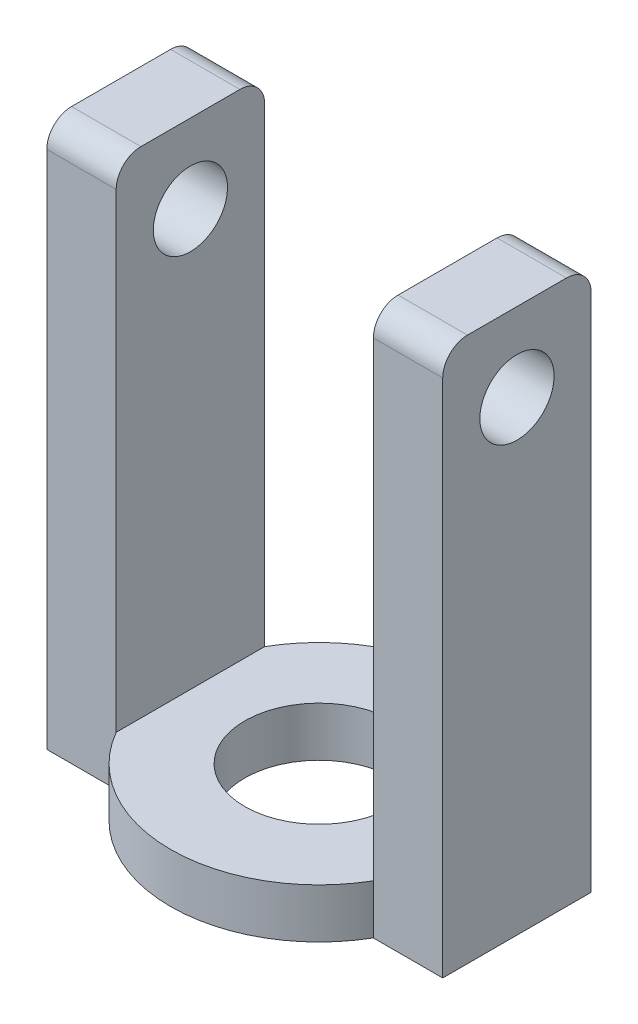
ISO-10303-21;
HEADER;
FILE_DESCRIPTION(('STEP AP214'),'2;1');
FILE_NAME('part.step','',(''),(''),'','','');
FILE_SCHEMA(('AUTOMOTIVE_DESIGN { 1 0 10303 214 1 1 1 1 }'));
ENDSEC;
DATA;
#1=APPLICATION_CONTEXT('core data for automotive mechanical design processes');
#2=APPLICATION_PROTOCOL_DEFINITION('international standard','automotive_design',2000,#1);
#3=PRODUCT_CONTEXT('',#1,'mechanical');
#4=PRODUCT('Part','Part','',(#3));
#5=PRODUCT_RELATED_PRODUCT_CATEGORY('part','',(#4));
#6=PRODUCT_DEFINITION_FORMATION('','',#4);
#7=PRODUCT_DEFINITION_CONTEXT('part definition',#1,'design');
#8=PRODUCT_DEFINITION('design','',#6,#7);
#9=PRODUCT_DEFINITION_SHAPE('','',#8);
#10=(LENGTH_UNIT() NAMED_UNIT(*) SI_UNIT(.MILLI.,.METRE.));
#11=(NAMED_UNIT(*) PLANE_ANGLE_UNIT() SI_UNIT($,.RADIAN.));
#12=(NAMED_UNIT(*) SI_UNIT($,.STERADIAN.) SOLID_ANGLE_UNIT());
#13=UNCERTAINTY_MEASURE_WITH_UNIT(LENGTH_MEASURE(1.E-05),#10,'distance_accuracy_value','');
#14=(GEOMETRIC_REPRESENTATION_CONTEXT(3) GLOBAL_UNCERTAINTY_ASSIGNED_CONTEXT((#13)) GLOBAL_UNIT_ASSIGNED_CONTEXT((#10,
#11,#12)) REPRESENTATION_CONTEXT('',''));
#15=CARTESIAN_POINT('',(0.,0.,0.));
#16=DIRECTION('',(0.,0.,1.));
#17=DIRECTION('',(1.,0.,0.));
#18=AXIS2_PLACEMENT_3D('',#15,#16,#17);
#19=CARTESIAN_POINT('',(0.,100.,0.));
#20=DIRECTION('',(0.,1.,0.));
#21=DIRECTION('',(0.,0.,1.));
#22=AXIS2_PLACEMENT_3D('',#19,#20,#21);
#23=PLANE('',#22);
#24=CARTESIAN_POINT('',(0.,100.,0.));
#25=DIRECTION('',(0.,1.,0.));
#26=DIRECTION('',(0.,0.,1.));
#27=AXIS2_PLACEMENT_3D('',#24,#25,#26);
#28=CIRCLE('',#27,150.);
#29=CARTESIAN_POINT('',(0.,100.,150.));
#30=VERTEX_POINT('',#29);
#31=EDGE_CURVE('E350',#30,#30,#28,.T.);
#32=ORIENTED_EDGE('',*,*,#31,.F.);
#33=EDGE_LOOP('',(#32));
#34=FACE_BOUND('',#33,.T.);
#35=CARTESIAN_POINT('',(0.,100.,0.));
#36=DIRECTION('',(0.,1.,0.));
#37=DIRECTION('',(0.,0.,1.));
#38=AXIS2_PLACEMENT_3D('',#35,#36,#37);
#39=CIRCLE('',#38,300.);
#40=CARTESIAN_POINT('',(-259.807621135332,100.,150.));
#41=VERTEX_POINT('',#40);
#42=CARTESIAN_POINT('',(259.807621135332,100.,150.));
#43=VERTEX_POINT('',#42);
#44=EDGE_CURVE('E159',#41,#43,#39,.T.);
#45=ORIENTED_EDGE('',*,*,#44,.T.);
#46=DIRECTION('',(0.,0.,1.));
#47=VECTOR('',#46,1.);
#48=CARTESIAN_POINT('',(259.807621135332,100.,-150.));
#49=LINE('',#48,#47);
#50=CARTESIAN_POINT('',(259.807621135332,100.,-150.));
#51=VERTEX_POINT('',#50);
#52=EDGE_CURVE('E148',#51,#43,#49,.T.);
#53=ORIENTED_EDGE('',*,*,#52,.F.);
#54=CARTESIAN_POINT('',(0.,100.,0.));
#55=DIRECTION('',(0.,1.,0.));
#56=DIRECTION('',(0.,0.,1.));
#57=AXIS2_PLACEMENT_3D('',#54,#55,#56);
#58=CIRCLE('',#57,300.);
#59=CARTESIAN_POINT('',(-259.807621135332,100.,-150.));
#60=VERTEX_POINT('',#59);
#61=EDGE_CURVE('E165',#51,#60,#58,.T.);
#62=ORIENTED_EDGE('',*,*,#61,.T.);
#63=DIRECTION('',(0.,0.,1.));
#64=VECTOR('',#63,1.);
#65=CARTESIAN_POINT('',(-259.807621135332,100.,-150.));
#66=LINE('',#65,#64);
#67=EDGE_CURVE('E154',#60,#41,#66,.T.);
#68=ORIENTED_EDGE('',*,*,#67,.T.);
#69=EDGE_LOOP('',(#45,#53,#62,#68));
#70=FACE_BOUND('',#69,.T.);
#71=ADVANCED_FACE('F34',(#34,#70),#23,.T.);
#72=CARTESIAN_POINT('',(0.,100.,0.));
#73=DIRECTION('',(0.,-1.,0.));
#74=DIRECTION('',(0.,0.,-1.));
#75=AXIS2_PLACEMENT_3D('',#72,#73,#74);
#76=CYLINDRICAL_SURFACE('',#75,300.);
#77=CARTESIAN_POINT('',(0.,0.,0.));
#78=DIRECTION('',(0.,1.,0.));
#79=DIRECTION('',(0.,0.,1.));
#80=AXIS2_PLACEMENT_3D('',#77,#78,#79);
#81=CIRCLE('',#80,300.);
#82=CARTESIAN_POINT('',(259.807621135332,0.,-150.));
#83=VERTEX_POINT('',#82);
#84=CARTESIAN_POINT('',(-259.807621135332,0.,-150.));
#85=VERTEX_POINT('',#84);
#86=EDGE_CURVE('E321',#83,#85,#81,.T.);
#87=ORIENTED_EDGE('',*,*,#86,.T.);
#88=DIRECTION('',(0.,-1.,0.));
#89=VECTOR('',#88,1.);
#90=CARTESIAN_POINT('',(-259.807621135332,100.,-150.));
#91=LINE('',#90,#89);
#92=EDGE_CURVE('E182',#60,#85,#91,.T.);
#93=ORIENTED_EDGE('',*,*,#92,.F.);
#94=ORIENTED_EDGE('',*,*,#61,.F.);
#95=DIRECTION('',(0.,-1.,0.));
#96=VECTOR('',#95,1.);
#97=CARTESIAN_POINT('',(259.807621135332,100.,-150.));
#98=LINE('',#97,#96);
#99=EDGE_CURVE('E164',#51,#83,#98,.T.);
#100=ORIENTED_EDGE('',*,*,#99,.T.);
#101=EDGE_LOOP('',(#87,#93,#94,#100));
#102=FACE_BOUND('',#101,.T.);
#103=ADVANCED_FACE('F257',(#102),#76,.T.);
#104=CARTESIAN_POINT('',(0.,100.,-150.));
#105=DIRECTION('',(0.,0.,-1.));
#106=DIRECTION('',(-1.,0.,0.));
#107=AXIS2_PLACEMENT_3D('',#104,#105,#106);
#108=PLANE('',#107);
#109=DIRECTION('',(0.,-1.,0.));
#110=VECTOR('',#109,1.);
#111=CARTESIAN_POINT('',(-400.,100.,-150.));
#112=LINE('',#111,#110);
#113=CARTESIAN_POINT('',(-400.,1050.,-150.));
#114=VERTEX_POINT('',#113);
#115=CARTESIAN_POINT('',(-400.,0.,-150.));
#116=VERTEX_POINT('',#115);
#117=EDGE_CURVE('E180',#114,#116,#112,.T.);
#118=ORIENTED_EDGE('',*,*,#117,.F.);
#119=DIRECTION('',(1.,0.,0.));
#120=VECTOR('',#119,1.);
#121=CARTESIAN_POINT('',(-259.807621135332,1050.,-150.));
#122=LINE('',#121,#120);
#123=CARTESIAN_POINT('',(-259.807621135332,1050.,-150.));
#124=VERTEX_POINT('',#123);
#125=EDGE_CURVE('E199',#114,#124,#122,.T.);
#126=ORIENTED_EDGE('',*,*,#125,.T.);
#127=DIRECTION('',(0.,-1.,0.));
#128=VECTOR('',#127,1.);
#129=CARTESIAN_POINT('',(-259.807621135332,1100.,-150.));
#130=LINE('',#129,#128);
#131=EDGE_CURVE('E340',#124,#60,#130,.T.);
#132=ORIENTED_EDGE('',*,*,#131,.T.);
#133=ORIENTED_EDGE('',*,*,#92,.T.);
#134=DIRECTION('',(1.,0.,0.));
#135=VECTOR('',#134,1.);
#136=CARTESIAN_POINT('',(0.,0.,-150.));
#137=LINE('',#136,#135);
#138=EDGE_CURVE('E317',#116,#85,#137,.T.);
#139=ORIENTED_EDGE('',*,*,#138,.F.);
#140=EDGE_LOOP('',(#118,#126,#132,#133,#139));
#141=FACE_BOUND('',#140,.T.);
#142=ADVANCED_FACE('F263',(#141),#108,.T.);
#143=CARTESIAN_POINT('',(-400.,100.,0.));
#144=DIRECTION('',(1.,0.,0.));
#145=DIRECTION('',(0.,0.,-1.));
#146=AXIS2_PLACEMENT_3D('',#143,#144,#145);
#147=PLANE('',#146);
#148=CARTESIAN_POINT('',(-400.,941.064540291286,0.));
#149=DIRECTION('',(-1.,0.,0.));
#150=DIRECTION('',(0.,0.,1.));
#151=AXIS2_PLACEMENT_3D('',#148,#149,#150);
#152=CIRCLE('',#151,75.);
#153=CARTESIAN_POINT('',(-400.,941.064540291286,75.));
#154=VERTEX_POINT('',#153);
#155=EDGE_CURVE('E358',#154,#154,#152,.T.);
#156=ORIENTED_EDGE('',*,*,#155,.F.);
#157=EDGE_LOOP('',(#156));
#158=FACE_BOUND('',#157,.T.);
#159=DIRECTION('',(0.,-1.,0.));
#160=VECTOR('',#159,1.);
#161=CARTESIAN_POINT('',(-400.,100.,150.));
#162=LINE('',#161,#160);
#163=CARTESIAN_POINT('',(-400.,1050.,150.));
#164=VERTEX_POINT('',#163);
#165=CARTESIAN_POINT('',(-400.,0.,150.));
#166=VERTEX_POINT('',#165);
#167=EDGE_CURVE('E173',#164,#166,#162,.T.);
#168=ORIENTED_EDGE('',*,*,#167,.F.);
#169=CARTESIAN_POINT('',(-400.,1050.,100.));
#170=DIRECTION('',(1.,0.,0.));
#171=DIRECTION('',(0.,0.,-1.));
#172=AXIS2_PLACEMENT_3D('',#169,#170,#171);
#173=CIRCLE('',#172,50.);
#174=CARTESIAN_POINT('',(-400.,1100.,100.));
#175=VERTEX_POINT('',#174);
#176=EDGE_CURVE('E197',#164,#175,#173,.F.);
#177=ORIENTED_EDGE('',*,*,#176,.T.);
#178=DIRECTION('',(0.,0.,1.));
#179=VECTOR('',#178,1.);
#180=CARTESIAN_POINT('',(-400.,1100.,-150.));
#181=LINE('',#180,#179);
#182=CARTESIAN_POINT('',(-400.,1100.,-100.));
#183=VERTEX_POINT('',#182);
#184=EDGE_CURVE('E313',#183,#175,#181,.T.);
#185=ORIENTED_EDGE('',*,*,#184,.F.);
#186=CARTESIAN_POINT('',(-400.,1050.,-100.));
#187=DIRECTION('',(1.,0.,0.));
#188=DIRECTION('',(0.,0.,-1.));
#189=AXIS2_PLACEMENT_3D('',#186,#187,#188);
#190=CIRCLE('',#189,50.);
#191=EDGE_CURVE('E195',#183,#114,#190,.F.);
#192=ORIENTED_EDGE('',*,*,#191,.T.);
#193=ORIENTED_EDGE('',*,*,#117,.T.);
#194=DIRECTION('',(0.,0.,1.));
#195=VECTOR('',#194,1.);
#196=CARTESIAN_POINT('',(-400.,0.,0.));
#197=LINE('',#196,#195);
#198=EDGE_CURVE('E320',#116,#166,#197,.T.);
#199=ORIENTED_EDGE('',*,*,#198,.T.);
#200=EDGE_LOOP('',(#168,#177,#185,#192,#193,#199));
#201=FACE_BOUND('',#200,.T.);
#202=ADVANCED_FACE('F286',(#158,#201),#147,.F.);
#203=CARTESIAN_POINT('',(0.,100.,150.));
#204=DIRECTION('',(0.,0.,-1.));
#205=DIRECTION('',(-1.,0.,0.));
#206=AXIS2_PLACEMENT_3D('',#203,#204,#205);
#207=PLANE('',#206);
#208=DIRECTION('',(0.,-1.,0.));
#209=VECTOR('',#208,1.);
#210=CARTESIAN_POINT('',(-259.807621135332,1100.,150.));
#211=LINE('',#210,#209);
#212=CARTESIAN_POINT('',(-259.807621135332,1050.,150.));
#213=VERTEX_POINT('',#212);
#214=EDGE_CURVE('E325',#213,#41,#211,.T.);
#215=ORIENTED_EDGE('',*,*,#214,.F.);
#216=DIRECTION('',(1.,0.,0.));
#217=VECTOR('',#216,1.);
#218=CARTESIAN_POINT('',(0.,1050.,150.));
#219=LINE('',#218,#217);
#220=EDGE_CURVE('E193',#213,#164,#219,.F.);
#221=ORIENTED_EDGE('',*,*,#220,.T.);
#222=ORIENTED_EDGE('',*,*,#167,.T.);
#223=DIRECTION('',(1.,0.,0.));
#224=VECTOR('',#223,1.);
#225=CARTESIAN_POINT('',(0.,0.,150.));
#226=LINE('',#225,#224);
#227=CARTESIAN_POINT('',(-259.807621135332,0.,150.));
#228=VERTEX_POINT('',#227);
#229=EDGE_CURVE('E323',#166,#228,#226,.T.);
#230=ORIENTED_EDGE('',*,*,#229,.T.);
#231=DIRECTION('',(0.,-1.,0.));
#232=VECTOR('',#231,1.);
#233=CARTESIAN_POINT('',(-259.807621135332,100.,150.));
#234=LINE('',#233,#232);
#235=EDGE_CURVE('E170',#41,#228,#234,.T.);
#236=ORIENTED_EDGE('',*,*,#235,.F.);
#237=EDGE_LOOP('',(#215,#221,#222,#230,#236));
#238=FACE_BOUND('',#237,.T.);
#239=ADVANCED_FACE('F283',(#238),#207,.F.);
#240=CARTESIAN_POINT('',(0.,100.,0.));
#241=DIRECTION('',(0.,-1.,0.));
#242=DIRECTION('',(0.,0.,-1.));
#243=AXIS2_PLACEMENT_3D('',#240,#241,#242);
#244=CYLINDRICAL_SURFACE('',#243,300.);
#245=CARTESIAN_POINT('',(0.,0.,0.));
#246=DIRECTION('',(0.,1.,0.));
#247=DIRECTION('',(0.,0.,1.));
#248=AXIS2_PLACEMENT_3D('',#245,#246,#247);
#249=CIRCLE('',#248,300.);
#250=CARTESIAN_POINT('',(259.807621135332,0.,150.));
#251=VERTEX_POINT('',#250);
#252=EDGE_CURVE('E169',#228,#251,#249,.T.);
#253=ORIENTED_EDGE('',*,*,#252,.T.);
#254=DIRECTION('',(0.,-1.,0.));
#255=VECTOR('',#254,1.);
#256=CARTESIAN_POINT('',(259.807621135332,100.,150.));
#257=LINE('',#256,#255);
#258=EDGE_CURVE('E141',#43,#251,#257,.T.);
#259=ORIENTED_EDGE('',*,*,#258,.F.);
#260=ORIENTED_EDGE('',*,*,#44,.F.);
#261=ORIENTED_EDGE('',*,*,#235,.T.);
#262=EDGE_LOOP('',(#253,#259,#260,#261));
#263=FACE_BOUND('',#262,.T.);
#264=ADVANCED_FACE('F167',(#263),#244,.T.);
#265=CARTESIAN_POINT('',(0.,100.,150.));
#266=DIRECTION('',(0.,0.,-1.));
#267=DIRECTION('',(-1.,0.,0.));
#268=AXIS2_PLACEMENT_3D('',#265,#266,#267);
#269=PLANE('',#268);
#270=DIRECTION('',(0.,-1.,0.));
#271=VECTOR('',#270,1.);
#272=CARTESIAN_POINT('',(400.,100.,150.));
#273=LINE('',#272,#271);
#274=CARTESIAN_POINT('',(400.,1050.,150.));
#275=VERTEX_POINT('',#274);
#276=CARTESIAN_POINT('',(400.,0.,150.));
#277=VERTEX_POINT('',#276);
#278=EDGE_CURVE('E171',#275,#277,#273,.T.);
#279=ORIENTED_EDGE('',*,*,#278,.F.);
#280=DIRECTION('',(1.,0.,0.));
#281=VECTOR('',#280,1.);
#282=CARTESIAN_POINT('',(0.,1050.,150.));
#283=LINE('',#282,#281);
#284=CARTESIAN_POINT('',(259.807621135332,1050.,150.));
#285=VERTEX_POINT('',#284);
#286=EDGE_CURVE('E58',#275,#285,#283,.F.);
#287=ORIENTED_EDGE('',*,*,#286,.T.);
#288=DIRECTION('',(0.,-1.,0.));
#289=VECTOR('',#288,1.);
#290=CARTESIAN_POINT('',(259.807621135332,1100.,150.));
#291=LINE('',#290,#289);
#292=EDGE_CURVE('E136',#285,#43,#291,.T.);
#293=ORIENTED_EDGE('',*,*,#292,.T.);
#294=ORIENTED_EDGE('',*,*,#258,.T.);
#295=DIRECTION('',(1.,0.,0.));
#296=VECTOR('',#295,1.);
#297=CARTESIAN_POINT('',(0.,0.,150.));
#298=LINE('',#297,#296);
#299=EDGE_CURVE('E226',#251,#277,#298,.T.);
#300=ORIENTED_EDGE('',*,*,#299,.T.);
#301=EDGE_LOOP('',(#279,#287,#293,#294,#300));
#302=FACE_BOUND('',#301,.T.);
#303=ADVANCED_FACE('F138',(#302),#269,.F.);
#304=CARTESIAN_POINT('',(400.,100.,0.));
#305=DIRECTION('',(1.,0.,0.));
#306=DIRECTION('',(0.,0.,-1.));
#307=AXIS2_PLACEMENT_3D('',#304,#305,#306);
#308=PLANE('',#307);
#309=CARTESIAN_POINT('',(400.,941.064540291286,0.));
#310=DIRECTION('',(-1.,0.,0.));
#311=DIRECTION('',(0.,0.,1.));
#312=AXIS2_PLACEMENT_3D('',#309,#310,#311);
#313=CIRCLE('',#312,75.);
#314=CARTESIAN_POINT('',(400.,941.064540291286,75.));
#315=VERTEX_POINT('',#314);
#316=EDGE_CURVE('E361',#315,#315,#313,.T.);
#317=ORIENTED_EDGE('',*,*,#316,.T.);
#318=EDGE_LOOP('',(#317));
#319=FACE_BOUND('',#318,.T.);
#320=DIRECTION('',(0.,0.,1.));
#321=VECTOR('',#320,1.);
#322=CARTESIAN_POINT('',(400.,1100.,-150.));
#323=LINE('',#322,#321);
#324=CARTESIAN_POINT('',(400.,1100.,-100.));
#325=VERTEX_POINT('',#324);
#326=CARTESIAN_POINT('',(400.,1100.,100.));
#327=VERTEX_POINT('',#326);
#328=EDGE_CURVE('E155',#325,#327,#323,.T.);
#329=ORIENTED_EDGE('',*,*,#328,.T.);
#330=CARTESIAN_POINT('',(400.,1050.,100.));
#331=DIRECTION('',(1.,0.,0.));
#332=DIRECTION('',(0.,0.,-1.));
#333=AXIS2_PLACEMENT_3D('',#330,#331,#332);
#334=CIRCLE('',#333,50.);
#335=EDGE_CURVE('E209',#327,#275,#334,.T.);
#336=ORIENTED_EDGE('',*,*,#335,.T.);
#337=ORIENTED_EDGE('',*,*,#278,.T.);
#338=DIRECTION('',(0.,0.,1.));
#339=VECTOR('',#338,1.);
#340=CARTESIAN_POINT('',(400.,0.,0.));
#341=LINE('',#340,#339);
#342=CARTESIAN_POINT('',(400.,0.,-150.));
#343=VERTEX_POINT('',#342);
#344=EDGE_CURVE('E229',#343,#277,#341,.T.);
#345=ORIENTED_EDGE('',*,*,#344,.F.);
#346=DIRECTION('',(0.,-1.,0.));
#347=VECTOR('',#346,1.);
#348=CARTESIAN_POINT('',(400.,100.,-150.));
#349=LINE('',#348,#347);
#350=CARTESIAN_POINT('',(400.,1050.,-150.));
#351=VERTEX_POINT('',#350);
#352=EDGE_CURVE('E175',#351,#343,#349,.T.);
#353=ORIENTED_EDGE('',*,*,#352,.F.);
#354=CARTESIAN_POINT('',(400.,1050.,-100.));
#355=DIRECTION('',(1.,0.,0.));
#356=DIRECTION('',(0.,0.,-1.));
#357=AXIS2_PLACEMENT_3D('',#354,#355,#356);
#358=CIRCLE('',#357,50.);
#359=EDGE_CURVE('E207',#351,#325,#358,.T.);
#360=ORIENTED_EDGE('',*,*,#359,.T.);
#361=EDGE_LOOP('',(#329,#336,#337,#345,#353,#360));
#362=FACE_BOUND('',#361,.T.);
#363=ADVANCED_FACE('F224',(#319,#362),#308,.T.);
#364=CARTESIAN_POINT('',(0.,100.,-150.));
#365=DIRECTION('',(0.,0.,-1.));
#366=DIRECTION('',(-1.,0.,0.));
#367=AXIS2_PLACEMENT_3D('',#364,#365,#366);
#368=PLANE('',#367);
#369=DIRECTION('',(0.,-1.,0.));
#370=VECTOR('',#369,1.);
#371=CARTESIAN_POINT('',(259.807621135332,1100.,-150.));
#372=LINE('',#371,#370);
#373=CARTESIAN_POINT('',(259.807621135332,1050.,-150.));
#374=VERTEX_POINT('',#373);
#375=EDGE_CURVE('E145',#374,#51,#372,.T.);
#376=ORIENTED_EDGE('',*,*,#375,.F.);
#377=DIRECTION('',(1.,0.,0.));
#378=VECTOR('',#377,1.);
#379=CARTESIAN_POINT('',(400.,1050.,-150.));
#380=LINE('',#379,#378);
#381=EDGE_CURVE('E11',#374,#351,#380,.T.);
#382=ORIENTED_EDGE('',*,*,#381,.T.);
#383=ORIENTED_EDGE('',*,*,#352,.T.);
#384=DIRECTION('',(1.,0.,0.));
#385=VECTOR('',#384,1.);
#386=CARTESIAN_POINT('',(0.,0.,-150.));
#387=LINE('',#386,#385);
#388=EDGE_CURVE('E235',#83,#343,#387,.T.);
#389=ORIENTED_EDGE('',*,*,#388,.F.);
#390=ORIENTED_EDGE('',*,*,#99,.F.);
#391=EDGE_LOOP('',(#376,#382,#383,#389,#390));
#392=FACE_BOUND('',#391,.T.);
#393=ADVANCED_FACE('F242',(#392),#368,.T.);
#394=CARTESIAN_POINT('',(0.,0.,0.));
#395=DIRECTION('',(0.,1.,0.));
#396=DIRECTION('',(0.,0.,1.));
#397=AXIS2_PLACEMENT_3D('',#394,#395,#396);
#398=PLANE('',#397);
#399=CARTESIAN_POINT('',(0.,0.,0.));
#400=DIRECTION('',(0.,1.,0.));
#401=DIRECTION('',(0.,0.,1.));
#402=AXIS2_PLACEMENT_3D('',#399,#400,#401);
#403=CIRCLE('',#402,150.);
#404=CARTESIAN_POINT('',(0.,0.,150.));
#405=VERTEX_POINT('',#404);
#406=EDGE_CURVE('E347',#405,#405,#403,.T.);
#407=ORIENTED_EDGE('',*,*,#406,.T.);
#408=EDGE_LOOP('',(#407));
#409=FACE_BOUND('',#408,.T.);
#410=ORIENTED_EDGE('',*,*,#86,.F.);
#411=ORIENTED_EDGE('',*,*,#388,.T.);
#412=ORIENTED_EDGE('',*,*,#344,.T.);
#413=ORIENTED_EDGE('',*,*,#299,.F.);
#414=ORIENTED_EDGE('',*,*,#252,.F.);
#415=ORIENTED_EDGE('',*,*,#229,.F.);
#416=ORIENTED_EDGE('',*,*,#198,.F.);
#417=ORIENTED_EDGE('',*,*,#138,.T.);
#418=EDGE_LOOP('',(#410,#411,#412,#413,#414,#415,#416,#417));
#419=FACE_BOUND('',#418,.T.);
#420=ADVANCED_FACE('F233',(#409,#419),#398,.F.);
#421=CARTESIAN_POINT('',(-259.807621135332,1100.,-150.));
#422=DIRECTION('',(1.,0.,0.));
#423=DIRECTION('',(0.,0.,-1.));
#424=AXIS2_PLACEMENT_3D('',#421,#422,#423);
#425=PLANE('',#424);
#426=CARTESIAN_POINT('',(-259.807621135332,941.064540291286,0.));
#427=DIRECTION('',(1.,0.,0.));
#428=DIRECTION('',(0.,0.,-1.));
#429=AXIS2_PLACEMENT_3D('',#426,#427,#428);
#430=CIRCLE('',#429,75.);
#431=CARTESIAN_POINT('',(-259.807621135332,941.064540291286,75.));
#432=VERTEX_POINT('',#431);
#433=EDGE_CURVE('E354',#432,#432,#430,.T.);
#434=ORIENTED_EDGE('',*,*,#433,.F.);
#435=EDGE_LOOP('',(#434));
#436=FACE_BOUND('',#435,.T.);
#437=DIRECTION('',(0.,0.,1.));
#438=VECTOR('',#437,1.);
#439=CARTESIAN_POINT('',(-259.807621135332,1100.,-150.));
#440=LINE('',#439,#438);
#441=CARTESIAN_POINT('',(-259.807621135332,1100.,-100.));
#442=VERTEX_POINT('',#441);
#443=CARTESIAN_POINT('',(-259.807621135332,1100.,100.));
#444=VERTEX_POINT('',#443);
#445=EDGE_CURVE('E337',#442,#444,#440,.T.);
#446=ORIENTED_EDGE('',*,*,#445,.T.);
#447=CARTESIAN_POINT('',(-259.807621135332,1050.,100.));
#448=DIRECTION('',(1.,0.,0.));
#449=DIRECTION('',(0.,0.,-1.));
#450=AXIS2_PLACEMENT_3D('',#447,#448,#449);
#451=CIRCLE('',#450,50.);
#452=EDGE_CURVE('E191',#444,#213,#451,.T.);
#453=ORIENTED_EDGE('',*,*,#452,.T.);
#454=ORIENTED_EDGE('',*,*,#214,.T.);
#455=ORIENTED_EDGE('',*,*,#67,.F.);
#456=ORIENTED_EDGE('',*,*,#131,.F.);
#457=CARTESIAN_POINT('',(-259.807621135332,1050.,-100.));
#458=DIRECTION('',(1.,0.,0.));
#459=DIRECTION('',(0.,0.,-1.));
#460=AXIS2_PLACEMENT_3D('',#457,#458,#459);
#461=CIRCLE('',#460,50.);
#462=EDGE_CURVE('E189',#124,#442,#461,.T.);
#463=ORIENTED_EDGE('',*,*,#462,.T.);
#464=EDGE_LOOP('',(#446,#453,#454,#455,#456,#463));
#465=FACE_BOUND('',#464,.T.);
#466=ADVANCED_FACE('F269',(#436,#465),#425,.T.);
#467=CARTESIAN_POINT('',(0.,1100.,0.));
#468=DIRECTION('',(0.,-1.,0.));
#469=DIRECTION('',(0.,0.,-1.));
#470=AXIS2_PLACEMENT_3D('',#467,#468,#469);
#471=PLANE('',#470);
#472=ORIENTED_EDGE('',*,*,#184,.T.);
#473=DIRECTION('',(1.,0.,0.));
#474=VECTOR('',#473,1.);
#475=CARTESIAN_POINT('',(0.,1100.,100.));
#476=LINE('',#475,#474);
#477=EDGE_CURVE('E186',#175,#444,#476,.T.);
#478=ORIENTED_EDGE('',*,*,#477,.T.);
#479=ORIENTED_EDGE('',*,*,#445,.F.);
#480=DIRECTION('',(1.,0.,0.));
#481=VECTOR('',#480,1.);
#482=CARTESIAN_POINT('',(-400.,1100.,-100.));
#483=LINE('',#482,#481);
#484=EDGE_CURVE('E184',#442,#183,#483,.F.);
#485=ORIENTED_EDGE('',*,*,#484,.T.);
#486=EDGE_LOOP('',(#472,#478,#479,#485));
#487=FACE_BOUND('',#486,.T.);
#488=ADVANCED_FACE('F336',(#487),#471,.F.);
#489=CARTESIAN_POINT('',(259.807621135332,1100.,-150.));
#490=DIRECTION('',(1.,0.,0.));
#491=DIRECTION('',(0.,0.,-1.));
#492=AXIS2_PLACEMENT_3D('',#489,#490,#491);
#493=PLANE('',#492);
#494=CARTESIAN_POINT('',(259.807621135332,941.064540291286,0.));
#495=DIRECTION('',(1.,0.,0.));
#496=DIRECTION('',(0.,0.,-1.));
#497=AXIS2_PLACEMENT_3D('',#494,#495,#496);
#498=CIRCLE('',#497,75.);
#499=CARTESIAN_POINT('',(259.807621135332,941.064540291286,75.));
#500=VERTEX_POINT('',#499);
#501=EDGE_CURVE('E38',#500,#500,#498,.T.);
#502=ORIENTED_EDGE('',*,*,#501,.T.);
#503=EDGE_LOOP('',(#502));
#504=FACE_BOUND('',#503,.T.);
#505=ORIENTED_EDGE('',*,*,#292,.F.);
#506=CARTESIAN_POINT('',(259.807621135332,1050.,100.));
#507=DIRECTION('',(1.,0.,0.));
#508=DIRECTION('',(0.,0.,-1.));
#509=AXIS2_PLACEMENT_3D('',#506,#507,#508);
#510=CIRCLE('',#509,50.);
#511=CARTESIAN_POINT('',(259.807621135332,1100.,100.));
#512=VERTEX_POINT('',#511);
#513=EDGE_CURVE('E43',#285,#512,#510,.F.);
#514=ORIENTED_EDGE('',*,*,#513,.T.);
#515=DIRECTION('',(0.,0.,1.));
#516=VECTOR('',#515,1.);
#517=CARTESIAN_POINT('',(259.807621135332,1100.,-150.));
#518=LINE('',#517,#516);
#519=CARTESIAN_POINT('',(259.807621135332,1100.,-100.));
#520=VERTEX_POINT('',#519);
#521=EDGE_CURVE('E144',#520,#512,#518,.T.);
#522=ORIENTED_EDGE('',*,*,#521,.F.);
#523=CARTESIAN_POINT('',(259.807621135332,1050.,-100.));
#524=DIRECTION('',(1.,0.,0.));
#525=DIRECTION('',(0.,0.,-1.));
#526=AXIS2_PLACEMENT_3D('',#523,#524,#525);
#527=CIRCLE('',#526,50.);
#528=EDGE_CURVE('E50',#520,#374,#527,.F.);
#529=ORIENTED_EDGE('',*,*,#528,.T.);
#530=ORIENTED_EDGE('',*,*,#375,.T.);
#531=ORIENTED_EDGE('',*,*,#52,.T.);
#532=EDGE_LOOP('',(#505,#514,#522,#529,#530,#531));
#533=FACE_BOUND('',#532,.T.);
#534=ADVANCED_FACE('F150',(#504,#533),#493,.F.);
#535=CARTESIAN_POINT('',(0.,1100.,0.));
#536=DIRECTION('',(0.,-1.,0.));
#537=DIRECTION('',(0.,0.,-1.));
#538=AXIS2_PLACEMENT_3D('',#535,#536,#537);
#539=PLANE('',#538);
#540=ORIENTED_EDGE('',*,*,#521,.T.);
#541=DIRECTION('',(1.,0.,0.));
#542=VECTOR('',#541,1.);
#543=CARTESIAN_POINT('',(0.,1100.,100.));
#544=LINE('',#543,#542);
#545=EDGE_CURVE('E204',#512,#327,#544,.T.);
#546=ORIENTED_EDGE('',*,*,#545,.T.);
#547=ORIENTED_EDGE('',*,*,#328,.F.);
#548=DIRECTION('',(1.,0.,0.));
#549=VECTOR('',#548,1.);
#550=CARTESIAN_POINT('',(259.807621135332,1100.,-100.));
#551=LINE('',#550,#549);
#552=EDGE_CURVE('E202',#325,#520,#551,.F.);
#553=ORIENTED_EDGE('',*,*,#552,.T.);
#554=EDGE_LOOP('',(#540,#546,#547,#553));
#555=FACE_BOUND('',#554,.T.);
#556=ADVANCED_FACE('F217',(#555),#539,.F.);
#557=CARTESIAN_POINT('',(0.,0.,0.));
#558=DIRECTION('',(0.,1.,0.));
#559=DIRECTION('',(0.,0.,1.));
#560=AXIS2_PLACEMENT_3D('',#557,#558,#559);
#561=CYLINDRICAL_SURFACE('',#560,150.);
#562=ORIENTED_EDGE('',*,*,#406,.F.);
#563=EDGE_LOOP('',(#562));
#564=FACE_BOUND('',#563,.T.);
#565=ORIENTED_EDGE('',*,*,#31,.T.);
#566=EDGE_LOOP('',(#565));
#567=FACE_BOUND('',#566,.T.);
#568=ADVANCED_FACE('F297',(#564,#567),#561,.F.);
#569=CARTESIAN_POINT('',(0.,1050.,100.));
#570=DIRECTION('',(1.,0.,0.));
#571=DIRECTION('',(0.,0.,-1.));
#572=AXIS2_PLACEMENT_3D('',#569,#570,#571);
#573=CYLINDRICAL_SURFACE('',#572,50.);
#574=ORIENTED_EDGE('',*,*,#176,.F.);
#575=ORIENTED_EDGE('',*,*,#220,.F.);
#576=ORIENTED_EDGE('',*,*,#452,.F.);
#577=ORIENTED_EDGE('',*,*,#477,.F.);
#578=EDGE_LOOP('',(#574,#575,#576,#577));
#579=FACE_BOUND('',#578,.T.);
#580=ADVANCED_FACE('F294',(#579),#573,.T.);
#581=CARTESIAN_POINT('',(0.,1050.,-100.));
#582=DIRECTION('',(-1.,0.,0.));
#583=DIRECTION('',(0.,0.,1.));
#584=AXIS2_PLACEMENT_3D('',#581,#582,#583);
#585=CYLINDRICAL_SURFACE('',#584,50.);
#586=ORIENTED_EDGE('',*,*,#191,.F.);
#587=ORIENTED_EDGE('',*,*,#484,.F.);
#588=ORIENTED_EDGE('',*,*,#462,.F.);
#589=ORIENTED_EDGE('',*,*,#125,.F.);
#590=EDGE_LOOP('',(#586,#587,#588,#589));
#591=FACE_BOUND('',#590,.T.);
#592=ADVANCED_FACE('F255',(#591),#585,.T.);
#593=CARTESIAN_POINT('',(0.,1050.,100.));
#594=DIRECTION('',(1.,0.,0.));
#595=DIRECTION('',(0.,0.,-1.));
#596=AXIS2_PLACEMENT_3D('',#593,#594,#595);
#597=CYLINDRICAL_SURFACE('',#596,50.);
#598=ORIENTED_EDGE('',*,*,#513,.F.);
#599=ORIENTED_EDGE('',*,*,#286,.F.);
#600=ORIENTED_EDGE('',*,*,#335,.F.);
#601=ORIENTED_EDGE('',*,*,#545,.F.);
#602=EDGE_LOOP('',(#598,#599,#600,#601));
#603=FACE_BOUND('',#602,.T.);
#604=ADVANCED_FACE('F222',(#603),#597,.T.);
#605=CARTESIAN_POINT('',(0.,1050.,-100.));
#606=DIRECTION('',(-1.,0.,0.));
#607=DIRECTION('',(0.,0.,1.));
#608=AXIS2_PLACEMENT_3D('',#605,#606,#607);
#609=CYLINDRICAL_SURFACE('',#608,50.);
#610=ORIENTED_EDGE('',*,*,#528,.F.);
#611=ORIENTED_EDGE('',*,*,#552,.F.);
#612=ORIENTED_EDGE('',*,*,#359,.F.);
#613=ORIENTED_EDGE('',*,*,#381,.F.);
#614=EDGE_LOOP('',(#610,#611,#612,#613));
#615=FACE_BOUND('',#614,.T.);
#616=ADVANCED_FACE('F36',(#615),#609,.T.);
#617=CARTESIAN_POINT('',(400.,941.064540291286,0.));
#618=DIRECTION('',(-1.,0.,0.));
#619=DIRECTION('',(0.,0.,1.));
#620=AXIS2_PLACEMENT_3D('',#617,#618,#619);
#621=CYLINDRICAL_SURFACE('',#620,75.);
#622=CARTESIAN_POINT('',(400.,941.064540291286,75.));
#623=CARTESIAN_POINT('',(398.53966272016,941.064540291286,75.));
#624=CARTESIAN_POINT('',(397.079325440319,941.064540291286,75.));
#625=CARTESIAN_POINT('',(394.158650880639,941.064540291286,75.));
#626=CARTESIAN_POINT('',(392.698313600798,941.064540291286,75.));
#627=CARTESIAN_POINT('',(389.777639041118,941.064540291286,75.));
#628=CARTESIAN_POINT('',(388.317301761278,941.064540291286,75.));
#629=CARTESIAN_POINT('',(385.396627201597,941.064540291286,75.));
#630=CARTESIAN_POINT('',(383.936289921757,941.064540291286,75.));
#631=CARTESIAN_POINT('',(381.015615362076,941.064540291286,75.));
#632=CARTESIAN_POINT('',(379.555278082236,941.064540291286,75.));
#633=CARTESIAN_POINT('',(376.634603522555,941.064540291286,75.));
#634=CARTESIAN_POINT('',(375.174266242715,941.064540291286,75.));
#635=CARTESIAN_POINT('',(372.253591683034,941.064540291286,75.));
#636=CARTESIAN_POINT('',(370.793254403194,941.064540291286,75.));
#637=CARTESIAN_POINT('',(367.872579843513,941.064540291286,75.));
#638=CARTESIAN_POINT('',(366.412242563673,941.064540291286,75.));
#639=CARTESIAN_POINT('',(363.491568003993,941.064540291286,75.));
#640=CARTESIAN_POINT('',(362.031230724152,941.064540291286,75.));
#641=CARTESIAN_POINT('',(359.110556164472,941.064540291286,75.));
#642=CARTESIAN_POINT('',(357.650218884631,941.064540291286,75.));
#643=CARTESIAN_POINT('',(354.729544324951,941.064540291286,75.));
#644=CARTESIAN_POINT('',(353.269207045111,941.064540291286,75.));
#645=CARTESIAN_POINT('',(350.34853248543,941.064540291286,75.));
#646=CARTESIAN_POINT('',(348.88819520559,941.064540291286,75.));
#647=CARTESIAN_POINT('',(345.967520645909,941.064540291286,75.));
#648=CARTESIAN_POINT('',(344.507183366069,941.064540291286,75.));
#649=CARTESIAN_POINT('',(341.586508806388,941.064540291286,75.));
#650=CARTESIAN_POINT('',(340.126171526548,941.064540291286,75.));
#651=CARTESIAN_POINT('',(337.205496966867,941.064540291286,75.));
#652=CARTESIAN_POINT('',(335.745159687027,941.064540291286,75.));
#653=CARTESIAN_POINT('',(332.824485127346,941.064540291286,75.));
#654=CARTESIAN_POINT('',(331.364147847506,941.064540291286,75.));
#655=CARTESIAN_POINT('',(328.443473287826,941.064540291286,75.));
#656=CARTESIAN_POINT('',(326.983136007985,941.064540291286,75.));
#657=CARTESIAN_POINT('',(324.062461448305,941.064540291286,75.));
#658=CARTESIAN_POINT('',(322.602124168464,941.064540291286,75.));
#659=CARTESIAN_POINT('',(319.681449608784,941.064540291286,75.));
#660=CARTESIAN_POINT('',(318.221112328943,941.064540291286,75.));
#661=CARTESIAN_POINT('',(315.300437769263,941.064540291286,75.));
#662=CARTESIAN_POINT('',(313.840100489423,941.064540291286,75.));
#663=CARTESIAN_POINT('',(310.919425929742,941.064540291286,75.));
#664=CARTESIAN_POINT('',(309.459088649902,941.064540291286,75.));
#665=CARTESIAN_POINT('',(306.538414090221,941.064540291286,75.));
#666=CARTESIAN_POINT('',(305.078076810381,941.064540291286,75.));
#667=CARTESIAN_POINT('',(302.1574022507,941.064540291286,75.));
#668=CARTESIAN_POINT('',(300.69706497086,941.064540291286,75.));
#669=CARTESIAN_POINT('',(297.776390411179,941.064540291286,75.));
#670=CARTESIAN_POINT('',(296.316053131339,941.064540291286,75.));
#671=CARTESIAN_POINT('',(293.395378571658,941.064540291286,75.));
#672=CARTESIAN_POINT('',(291.935041291818,941.064540291286,75.));
#673=CARTESIAN_POINT('',(289.014366732138,941.064540291286,75.));
#674=CARTESIAN_POINT('',(287.554029452297,941.064540291286,75.));
#675=CARTESIAN_POINT('',(284.633354892617,941.064540291286,75.));
#676=CARTESIAN_POINT('',(283.173017612776,941.064540291286,75.));
#677=CARTESIAN_POINT('',(280.252343053096,941.064540291286,75.));
#678=CARTESIAN_POINT('',(278.792005773256,941.064540291286,75.));
#679=CARTESIAN_POINT('',(275.871331213575,941.064540291286,75.));
#680=CARTESIAN_POINT('',(274.410993933735,941.064540291286,75.));
#681=CARTESIAN_POINT('',(271.490319374054,941.064540291286,75.));
#682=CARTESIAN_POINT('',(270.029982094214,941.064540291286,75.));
#683=CARTESIAN_POINT('',(267.109307534533,941.064540291286,75.));
#684=CARTESIAN_POINT('',(265.648970254693,941.064540291286,75.));
#685=CARTESIAN_POINT('',(262.728295695012,941.064540291286,75.));
#686=CARTESIAN_POINT('',(261.267958415172,941.064540291286,75.));
#687=CARTESIAN_POINT('',(259.807621135332,941.064540291286,75.));
#688=B_SPLINE_CURVE_WITH_KNOTS('',3,(#622,#623,#624,#625,#626,#627,#628,#629,#630,#631,#632,
#633,#634,#635,#636,#637,#638,#639,#640,#641,#642,#643,#644,#645,#646,#647,#648,#649,#650,#651,
#652,#653,#654,#655,#656,#657,#658,#659,#660,#661,#662,#663,#664,#665,#666,#667,#668,#669,#670,
#671,#672,#673,#674,#675,#676,#677,#678,#679,#680,#681,#682,#683,#684,#685,#686,#687),
.UNSPECIFIED.,.F.,.F.,(4,2,2,2,2,2,2,2,2,2,2,2,2,2,2,2,2,2,2,2,2,2,2,2,2,2,2,2,2,2,2,2,4),(0.,
4.38101183952089,8.76202367904177,13.1430355185627,17.5240473580835,21.9050591976044,
26.2860710371253,30.6670828766462,35.048094716167,39.4291065556879,43.8101183952088,
48.1911302347297,52.5721420742506,56.9531539137715,61.3341657532924,65.7151775928133,
70.0961894323341,74.477201271855,78.8582131113759,83.2392249508968,87.6202367904176,
92.0012486299385,96.3822604694594,100.76327230898,105.144284148501,109.525295988022,
113.906307827543,118.287319667064,122.668331506585,127.049343346106,131.430355185626,
135.811367025147,140.192378864668),.UNSPECIFIED.);
#689=EDGE_CURVE('BSEAM247',#315,#500,#688,.T.);
#690=ORIENTED_EDGE('',*,*,#316,.F.);
#691=ORIENTED_EDGE('',*,*,#501,.F.);
#692=ORIENTED_EDGE('',*,*,#689,.T.);
#693=ORIENTED_EDGE('',*,*,#689,.F.);
#694=EDGE_LOOP('',(#690,#692,#691,#693));
#695=FACE_BOUND('',#694,.T.);
#696=ADVANCED_FACE('F247',(#695),#621,.F.);
#697=CARTESIAN_POINT('',(-259.807621135332,941.064540291286,75.));
#698=CARTESIAN_POINT('',(-261.267958415172,941.064540291286,75.));
#699=CARTESIAN_POINT('',(-262.728295695012,941.064540291286,75.));
#700=CARTESIAN_POINT('',(-265.648970254693,941.064540291286,75.));
#701=CARTESIAN_POINT('',(-267.109307534533,941.064540291286,75.));
#702=CARTESIAN_POINT('',(-270.029982094214,941.064540291286,75.));
#703=CARTESIAN_POINT('',(-271.490319374054,941.064540291286,75.));
#704=CARTESIAN_POINT('',(-274.410993933735,941.064540291286,75.));
#705=CARTESIAN_POINT('',(-275.871331213575,941.064540291286,75.));
#706=CARTESIAN_POINT('',(-278.792005773256,941.064540291286,75.));
#707=CARTESIAN_POINT('',(-280.252343053096,941.064540291286,75.));
#708=CARTESIAN_POINT('',(-283.173017612777,941.064540291286,75.));
#709=CARTESIAN_POINT('',(-284.633354892617,941.064540291286,75.));
#710=CARTESIAN_POINT('',(-287.554029452297,941.064540291286,75.));
#711=CARTESIAN_POINT('',(-289.014366732138,941.064540291286,75.));
#712=CARTESIAN_POINT('',(-291.935041291818,941.064540291286,75.));
#713=CARTESIAN_POINT('',(-293.395378571659,941.064540291286,75.));
#714=CARTESIAN_POINT('',(-296.316053131339,941.064540291286,75.));
#715=CARTESIAN_POINT('',(-297.776390411179,941.064540291286,75.));
#716=CARTESIAN_POINT('',(-300.69706497086,941.064540291286,75.));
#717=CARTESIAN_POINT('',(-302.1574022507,941.064540291286,75.));
#718=CARTESIAN_POINT('',(-305.078076810381,941.064540291286,75.));
#719=CARTESIAN_POINT('',(-306.538414090221,941.064540291286,75.));
#720=CARTESIAN_POINT('',(-309.459088649902,941.064540291286,75.));
#721=CARTESIAN_POINT('',(-310.919425929742,941.064540291286,75.));
#722=CARTESIAN_POINT('',(-313.840100489423,941.064540291286,75.));
#723=CARTESIAN_POINT('',(-315.300437769263,941.064540291286,75.));
#724=CARTESIAN_POINT('',(-318.221112328944,941.064540291286,75.));
#725=CARTESIAN_POINT('',(-319.681449608784,941.064540291286,75.));
#726=CARTESIAN_POINT('',(-322.602124168464,941.064540291286,75.));
#727=CARTESIAN_POINT('',(-324.062461448305,941.064540291286,75.));
#728=CARTESIAN_POINT('',(-326.983136007985,941.064540291286,75.));
#729=CARTESIAN_POINT('',(-328.443473287826,941.064540291286,75.));
#730=CARTESIAN_POINT('',(-331.364147847506,941.064540291286,75.));
#731=CARTESIAN_POINT('',(-332.824485127347,941.064540291286,75.));
#732=CARTESIAN_POINT('',(-335.745159687027,941.064540291286,75.));
#733=CARTESIAN_POINT('',(-337.205496966867,941.064540291286,75.));
#734=CARTESIAN_POINT('',(-340.126171526548,941.064540291286,75.));
#735=CARTESIAN_POINT('',(-341.586508806388,941.064540291286,75.));
#736=CARTESIAN_POINT('',(-344.507183366069,941.064540291286,75.));
#737=CARTESIAN_POINT('',(-345.967520645909,941.064540291286,75.));
#738=CARTESIAN_POINT('',(-348.88819520559,941.064540291286,75.));
#739=CARTESIAN_POINT('',(-350.34853248543,941.064540291286,75.));
#740=CARTESIAN_POINT('',(-353.269207045111,941.064540291286,75.));
#741=CARTESIAN_POINT('',(-354.729544324951,941.064540291286,75.));
#742=CARTESIAN_POINT('',(-357.650218884631,941.064540291286,75.));
#743=CARTESIAN_POINT('',(-359.110556164472,941.064540291286,75.));
#744=CARTESIAN_POINT('',(-362.031230724152,941.064540291286,75.));
#745=CARTESIAN_POINT('',(-363.491568003993,941.064540291286,75.));
#746=CARTESIAN_POINT('',(-366.412242563673,941.064540291286,75.));
#747=CARTESIAN_POINT('',(-367.872579843514,941.064540291286,75.));
#748=CARTESIAN_POINT('',(-370.793254403194,941.064540291286,75.));
#749=CARTESIAN_POINT('',(-372.253591683034,941.064540291286,75.));
#750=CARTESIAN_POINT('',(-375.174266242715,941.064540291286,75.));
#751=CARTESIAN_POINT('',(-376.634603522555,941.064540291286,75.));
#752=CARTESIAN_POINT('',(-379.555278082236,941.064540291286,75.));
#753=CARTESIAN_POINT('',(-381.015615362076,941.064540291286,75.));
#754=CARTESIAN_POINT('',(-383.936289921757,941.064540291286,75.));
#755=CARTESIAN_POINT('',(-385.396627201597,941.064540291286,75.));
#756=CARTESIAN_POINT('',(-388.317301761278,941.064540291286,75.));
#757=CARTESIAN_POINT('',(-389.777639041118,941.064540291286,75.));
#758=CARTESIAN_POINT('',(-392.698313600799,941.064540291286,75.));
#759=CARTESIAN_POINT('',(-394.158650880639,941.064540291286,75.));
#760=CARTESIAN_POINT('',(-397.079325440319,941.064540291286,75.));
#761=CARTESIAN_POINT('',(-398.53966272016,941.064540291286,75.));
#762=CARTESIAN_POINT('',(-400.,941.064540291286,75.));
#763=B_SPLINE_CURVE_WITH_KNOTS('',3,(#697,#698,#699,#700,#701,#702,#703,#704,#705,#706,#707,
#708,#709,#710,#711,#712,#713,#714,#715,#716,#717,#718,#719,#720,#721,#722,#723,#724,#725,#726,
#727,#728,#729,#730,#731,#732,#733,#734,#735,#736,#737,#738,#739,#740,#741,#742,#743,#744,#745,
#746,#747,#748,#749,#750,#751,#752,#753,#754,#755,#756,#757,#758,#759,#760,#761,#762),
.UNSPECIFIED.,.F.,.F.,(4,2,2,2,2,2,2,2,2,2,2,2,2,2,2,2,2,2,2,2,2,2,2,2,2,2,2,2,2,2,2,2,4),(0.,
4.38101183952089,8.76202367904177,13.1430355185627,17.5240473580835,21.9050591976044,
26.2860710371253,30.6670828766462,35.0480947161671,39.4291065556879,43.8101183952088,
48.1911302347296,52.5721420742505,56.9531539137714,61.3341657532923,65.7151775928132,
70.0961894323341,74.477201271855,78.8582131113759,83.2392249508968,87.6202367904176,
92.0012486299385,96.3822604694594,100.76327230898,105.144284148501,109.525295988022,
113.906307827543,118.287319667064,122.668331506585,127.049343346106,131.430355185626,
135.811367025147,140.192378864668),.UNSPECIFIED.);
#764=EDGE_CURVE('BSEAM252',#432,#154,#763,.T.);
#765=ORIENTED_EDGE('',*,*,#433,.T.);
#766=ORIENTED_EDGE('',*,*,#155,.T.);
#767=ORIENTED_EDGE('',*,*,#764,.T.);
#768=ORIENTED_EDGE('',*,*,#764,.F.);
#769=EDGE_LOOP('',(#765,#767,#766,#768));
#770=FACE_BOUND('',#769,.T.);
#771=ADVANCED_FACE('F252',(#770),#621,.F.);
#772=CLOSED_SHELL('',(#71,#103,#142,#202,#239,#264,#303,#363,#393,#420,#466,#488,#534,#556,#568,
#580,#592,#604,#616,#696,#771));
#773=MANIFOLD_SOLID_BREP('B2',#772);
#774=ADVANCED_BREP_SHAPE_REPRESENTATION('',(#18,#773),#14);
#775=SHAPE_DEFINITION_REPRESENTATION(#9,#774);
ENDSEC;
END-ISO-10303-21;
